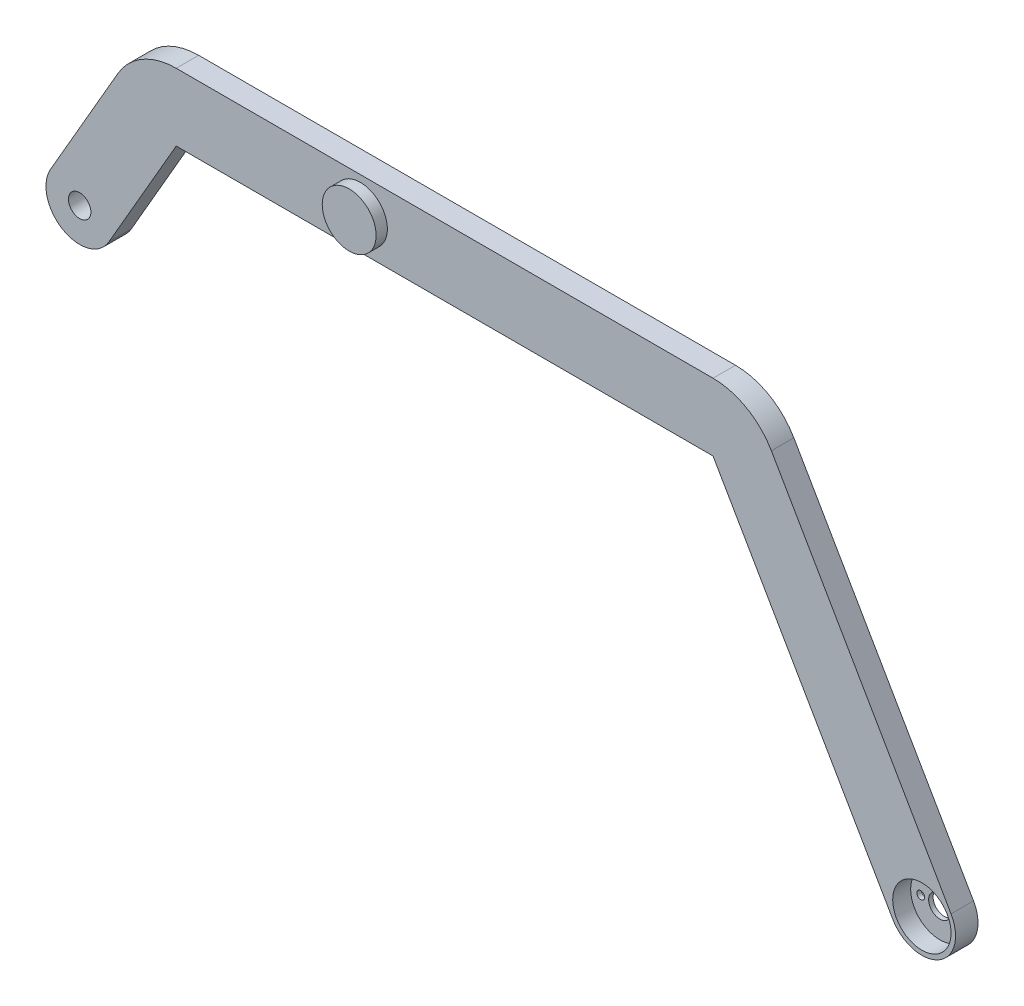
ISO-10303-21;
HEADER;
FILE_DESCRIPTION(('STEP AP214'),'2;1');
FILE_NAME('part.step','',(''),(''),'','','');
FILE_SCHEMA(('AUTOMOTIVE_DESIGN { 1 0 10303 214 1 1 1 1 }'));
ENDSEC;
DATA;
#1=APPLICATION_CONTEXT('core data for automotive mechanical design processes');
#2=APPLICATION_PROTOCOL_DEFINITION('international standard','automotive_design',2000,#1);
#3=PRODUCT_CONTEXT('',#1,'mechanical');
#4=PRODUCT('Part','Part','',(#3));
#5=PRODUCT_RELATED_PRODUCT_CATEGORY('part','',(#4));
#6=PRODUCT_DEFINITION_FORMATION('','',#4);
#7=PRODUCT_DEFINITION_CONTEXT('part definition',#1,'design');
#8=PRODUCT_DEFINITION('design','',#6,#7);
#9=PRODUCT_DEFINITION_SHAPE('','',#8);
#10=(LENGTH_UNIT() NAMED_UNIT(*) SI_UNIT(.MILLI.,.METRE.));
#11=(NAMED_UNIT(*) PLANE_ANGLE_UNIT() SI_UNIT($,.RADIAN.));
#12=(NAMED_UNIT(*) SI_UNIT($,.STERADIAN.) SOLID_ANGLE_UNIT());
#13=UNCERTAINTY_MEASURE_WITH_UNIT(LENGTH_MEASURE(1.E-05),#10,'distance_accuracy_value','');
#14=(GEOMETRIC_REPRESENTATION_CONTEXT(3) GLOBAL_UNCERTAINTY_ASSIGNED_CONTEXT((#13)) GLOBAL_UNIT_ASSIGNED_CONTEXT((#10,
#11,#12)) REPRESENTATION_CONTEXT('',''));
#15=CARTESIAN_POINT('',(0.,0.,0.));
#16=DIRECTION('',(0.,0.,1.));
#17=DIRECTION('',(1.,0.,0.));
#18=AXIS2_PLACEMENT_3D('',#15,#16,#17);
#19=CARTESIAN_POINT('',(258.499974642121,-146.043302059951,-10.));
#20=DIRECTION('',(0.,0.,1.));
#21=DIRECTION('',(-1.,0.,0.));
#22=AXIS2_PLACEMENT_3D('',#19,#20,#21);
#23=CYLINDRICAL_SURFACE('',#22,1.74999999999998);
#24=CARTESIAN_POINT('',(258.499974642121,-146.043302059951,-10.));
#25=DIRECTION('',(0.,0.,1.));
#26=DIRECTION('',(1.,0.,0.));
#27=AXIS2_PLACEMENT_3D('',#24,#25,#26);
#28=CIRCLE('',#27,1.74999999999998);
#29=CARTESIAN_POINT('',(260.249974642121,-146.043302059951,-10.));
#30=VERTEX_POINT('',#29);
#31=EDGE_CURVE('E155',#30,#30,#28,.T.);
#32=ORIENTED_EDGE('',*,*,#31,.F.);
#33=EDGE_LOOP('',(#32));
#34=FACE_BOUND('',#33,.T.);
#35=CARTESIAN_POINT('',(258.499974642121,-146.043302059951,-8.));
#36=DIRECTION('',(0.,0.,-1.));
#37=DIRECTION('',(-1.,0.,0.));
#38=AXIS2_PLACEMENT_3D('',#35,#36,#37);
#39=CIRCLE('',#38,1.74999999999998);
#40=CARTESIAN_POINT('',(256.749974642121,-146.043302059951,-8.));
#41=VERTEX_POINT('',#40);
#42=EDGE_CURVE('E488',#41,#41,#39,.T.);
#43=ORIENTED_EDGE('',*,*,#42,.F.);
#44=EDGE_LOOP('',(#43));
#45=FACE_BOUND('',#44,.T.);
#46=ADVANCED_FACE('F41',(#34,#45),#23,.F.);
#47=CARTESIAN_POINT('',(241.500025357879,-146.084827151071,-10.));
#48=DIRECTION('',(0.,0.,1.));
#49=DIRECTION('',(-1.,0.,0.));
#50=AXIS2_PLACEMENT_3D('',#47,#48,#49);
#51=CYLINDRICAL_SURFACE('',#50,1.75000000000001);
#52=CARTESIAN_POINT('',(241.500025357879,-146.084827151071,-10.));
#53=DIRECTION('',(0.,0.,1.));
#54=DIRECTION('',(1.,0.,0.));
#55=AXIS2_PLACEMENT_3D('',#52,#53,#54);
#56=CIRCLE('',#55,1.75000000000001);
#57=CARTESIAN_POINT('',(243.250025357879,-146.084827151071,-10.));
#58=VERTEX_POINT('',#57);
#59=EDGE_CURVE('E513',#58,#58,#56,.T.);
#60=ORIENTED_EDGE('',*,*,#59,.F.);
#61=EDGE_LOOP('',(#60));
#62=FACE_BOUND('',#61,.T.);
#63=CARTESIAN_POINT('',(241.500025357879,-146.084827151071,-8.));
#64=DIRECTION('',(0.,0.,-1.));
#65=DIRECTION('',(-1.,0.,0.));
#66=AXIS2_PLACEMENT_3D('',#63,#64,#65);
#67=CIRCLE('',#66,1.75000000000001);
#68=CARTESIAN_POINT('',(239.750025357879,-146.084827151071,-8.));
#69=VERTEX_POINT('',#68);
#70=EDGE_CURVE('E485',#69,#69,#67,.T.);
#71=ORIENTED_EDGE('',*,*,#70,.F.);
#72=EDGE_LOOP('',(#71));
#73=FACE_BOUND('',#72,.T.);
#74=ADVANCED_FACE('F238',(#62,#73),#51,.F.);
#75=CARTESIAN_POINT('',(250.,-146.064064605511,14.142135623731));
#76=DIRECTION('',(0.,0.,-1.));
#77=DIRECTION('',(1.,0.,0.));
#78=AXIS2_PLACEMENT_3D('',#75,#76,#77);
#79=CYLINDRICAL_SURFACE('',#78,4.99999999999999);
#80=CARTESIAN_POINT('',(250.,-146.064064605511,-10.));
#81=DIRECTION('',(0.,0.,1.));
#82=DIRECTION('',(1.,0.,0.));
#83=AXIS2_PLACEMENT_3D('',#80,#81,#82);
#84=CIRCLE('',#83,4.99999999999999);
#85=CARTESIAN_POINT('',(255.,-146.064064605511,-10.));
#86=VERTEX_POINT('',#85);
#87=EDGE_CURVE('E481',#86,#86,#84,.T.);
#88=ORIENTED_EDGE('',*,*,#87,.F.);
#89=EDGE_LOOP('',(#88));
#90=FACE_BOUND('',#89,.T.);
#91=CARTESIAN_POINT('',(250.,-146.064064605511,-8.));
#92=DIRECTION('',(0.,0.,-1.));
#93=DIRECTION('',(-1.,0.,0.));
#94=AXIS2_PLACEMENT_3D('',#91,#92,#93);
#95=CIRCLE('',#94,4.99999999999999);
#96=CARTESIAN_POINT('',(245.,-146.064064605511,-8.));
#97=VERTEX_POINT('',#96);
#98=EDGE_CURVE('E45',#97,#97,#95,.F.);
#99=ORIENTED_EDGE('',*,*,#98,.T.);
#100=EDGE_LOOP('',(#99));
#101=FACE_BOUND('',#100,.T.);
#102=ADVANCED_FACE('F244',(#90,#101),#79,.F.);
#103=CARTESIAN_POINT('',(-82.0096189432334,-15.,-10.));
#104=DIRECTION('',(0.,0.,1.));
#105=DIRECTION('',(-1.,0.,0.));
#106=AXIS2_PLACEMENT_3D('',#103,#104,#105);
#107=PLANE('',#106);
#108=CARTESIAN_POINT('',(-125.,-59.4615242270663,-10.));
#109=DIRECTION('',(0.,0.,1.));
#110=DIRECTION('',(1.,0.,0.));
#111=AXIS2_PLACEMENT_3D('',#108,#109,#110);
#112=CIRCLE('',#111,5.00000000000001);
#113=CARTESIAN_POINT('',(-120.,-59.4615242270663,-10.));
#114=VERTEX_POINT('',#113);
#115=EDGE_CURVE('E507',#114,#114,#112,.T.);
#116=ORIENTED_EDGE('',*,*,#115,.T.);
#117=EDGE_LOOP('',(#116));
#118=FACE_BOUND('',#117,.T.);
#119=ORIENTED_EDGE('',*,*,#87,.T.);
#120=EDGE_LOOP('',(#119));
#121=FACE_BOUND('',#120,.T.);
#122=CARTESIAN_POINT('',(0.,0.,-10.));
#123=DIRECTION('',(0.,0.,1.));
#124=DIRECTION('',(1.,0.,0.));
#125=AXIS2_PLACEMENT_3D('',#122,#123,#124);
#126=CIRCLE('',#125,5.);
#127=CARTESIAN_POINT('',(5.,0.,-10.));
#128=VERTEX_POINT('',#127);
#129=EDGE_CURVE('E515',#128,#128,#126,.T.);
#130=ORIENTED_EDGE('',*,*,#129,.T.);
#131=EDGE_LOOP('',(#130));
#132=FACE_BOUND('',#131,.T.);
#133=DIRECTION('',(-1.,0.,0.));
#134=VECTOR('',#133,1.);
#135=CARTESIAN_POINT('',(0.,15.,-10.));
#136=LINE('',#135,#134);
#137=CARTESIAN_POINT('',(157.009618943233,15.,-10.));
#138=VERTEX_POINT('',#137);
#139=CARTESIAN_POINT('',(-82.0096189432334,15.,-10.));
#140=VERTEX_POINT('',#139);
#141=EDGE_CURVE('E179',#138,#140,#136,.T.);
#142=ORIENTED_EDGE('',*,*,#141,.F.);
#143=CARTESIAN_POINT('',(157.009618943233,-15.,-10.));
#144=DIRECTION('',(0.,0.,1.));
#145=DIRECTION('',(1.,0.,0.));
#146=AXIS2_PLACEMENT_3D('',#143,#144,#145);
#147=CIRCLE('',#146,30.);
#148=CARTESIAN_POINT('',(182.990381056766,0.,-10.));
#149=VERTEX_POINT('',#148);
#150=EDGE_CURVE('E146',#149,#138,#147,.T.);
#151=ORIENTED_EDGE('',*,*,#150,.F.);
#152=DIRECTION('',(-0.5,0.866025403784438,0.));
#153=VECTOR('',#152,1.);
#154=CARTESIAN_POINT('',(262.990381056767,-138.564064605511,-10.));
#155=LINE('',#154,#153);
#156=CARTESIAN_POINT('',(262.990381056767,-138.564064605511,-10.));
#157=VERTEX_POINT('',#156);
#158=EDGE_CURVE('E126',#157,#149,#155,.T.);
#159=ORIENTED_EDGE('',*,*,#158,.F.);
#160=CARTESIAN_POINT('',(250.,-146.064064605511,-10.));
#161=DIRECTION('',(0.,0.,1.));
#162=DIRECTION('',(1.,0.,0.));
#163=AXIS2_PLACEMENT_3D('',#160,#161,#162);
#164=CIRCLE('',#163,15.);
#165=CARTESIAN_POINT('',(237.009618943233,-153.564064605511,-10.));
#166=VERTEX_POINT('',#165);
#167=EDGE_CURVE('E136',#166,#157,#164,.T.);
#168=ORIENTED_EDGE('',*,*,#167,.F.);
#169=DIRECTION('',(0.5,-0.866025403784439,0.));
#170=VECTOR('',#169,1.);
#171=CARTESIAN_POINT('',(157.009618943233,-15.,-10.));
#172=LINE('',#171,#170);
#173=CARTESIAN_POINT('',(157.009618943233,-15.,-10.));
#174=VERTEX_POINT('',#173);
#175=EDGE_CURVE('E141',#174,#166,#172,.T.);
#176=ORIENTED_EDGE('',*,*,#175,.F.);
#177=DIRECTION('',(1.,0.,0.));
#178=VECTOR('',#177,1.);
#179=CARTESIAN_POINT('',(0.,-15.,-10.));
#180=LINE('',#179,#178);
#181=CARTESIAN_POINT('',(-82.0096189432334,-15.,-10.));
#182=VERTEX_POINT('',#181);
#183=EDGE_CURVE('E214',#182,#174,#180,.T.);
#184=ORIENTED_EDGE('',*,*,#183,.F.);
#185=DIRECTION('',(0.5,0.866025403784438,0.));
#186=VECTOR('',#185,1.);
#187=CARTESIAN_POINT('',(-82.0096189432334,-15.,-10.));
#188=LINE('',#187,#186);
#189=CARTESIAN_POINT('',(-112.009618943233,-66.9615242270663,-10.));
#190=VERTEX_POINT('',#189);
#191=EDGE_CURVE('E211',#190,#182,#188,.T.);
#192=ORIENTED_EDGE('',*,*,#191,.F.);
#193=CARTESIAN_POINT('',(-125.,-59.4615242270666,-10.));
#194=DIRECTION('',(0.,0.,1.));
#195=DIRECTION('',(1.,0.,0.));
#196=AXIS2_PLACEMENT_3D('',#193,#194,#195);
#197=CIRCLE('',#196,15.);
#198=CARTESIAN_POINT('',(-137.990381056766,-51.9615242270664,-10.));
#199=VERTEX_POINT('',#198);
#200=EDGE_CURVE('E208',#199,#190,#197,.T.);
#201=ORIENTED_EDGE('',*,*,#200,.F.);
#202=DIRECTION('',(-0.5,-0.866025403784438,0.));
#203=VECTOR('',#202,1.);
#204=CARTESIAN_POINT('',(-137.990381056767,-51.9615242270663,-10.));
#205=LINE('',#204,#203);
#206=CARTESIAN_POINT('',(-107.990381056767,0.,-10.));
#207=VERTEX_POINT('',#206);
#208=EDGE_CURVE('E202',#207,#199,#205,.T.);
#209=ORIENTED_EDGE('',*,*,#208,.F.);
#210=CARTESIAN_POINT('',(-82.0096189432334,-15.,-10.));
#211=DIRECTION('',(0.,0.,1.));
#212=DIRECTION('',(-1.,0.,0.));
#213=AXIS2_PLACEMENT_3D('',#210,#211,#212);
#214=CIRCLE('',#213,30.);
#215=EDGE_CURVE('E192',#140,#207,#214,.T.);
#216=ORIENTED_EDGE('',*,*,#215,.F.);
#217=EDGE_LOOP('',(#142,#151,#159,#168,#176,#184,#192,#201,#209,#216));
#218=FACE_BOUND('',#217,.T.);
#219=ORIENTED_EDGE('',*,*,#31,.T.);
#220=EDGE_LOOP('',(#219));
#221=FACE_BOUND('',#220,.T.);
#222=ORIENTED_EDGE('',*,*,#59,.T.);
#223=EDGE_LOOP('',(#222));
#224=FACE_BOUND('',#223,.T.);
#225=ADVANCED_FACE('F144',(#118,#121,#132,#218,#221,#224),#107,.F.);
#226=CARTESIAN_POINT('',(-82.0096189432334,-15.,0.));
#227=DIRECTION('',(0.,0.,1.));
#228=DIRECTION('',(-1.,0.,0.));
#229=AXIS2_PLACEMENT_3D('',#226,#227,#228);
#230=PLANE('',#229);
#231=CARTESIAN_POINT('',(250.,-146.064064605511,0.));
#232=DIRECTION('',(0.,0.,-1.));
#233=DIRECTION('',(-1.,0.,0.));
#234=AXIS2_PLACEMENT_3D('',#231,#232,#233);
#235=CIRCLE('',#234,13.);
#236=CARTESIAN_POINT('',(237.,-146.064064605511,0.));
#237=VERTEX_POINT('',#236);
#238=EDGE_CURVE('E491',#237,#237,#235,.T.);
#239=ORIENTED_EDGE('',*,*,#238,.T.);
#240=EDGE_LOOP('',(#239));
#241=FACE_BOUND('',#240,.T.);
#242=CARTESIAN_POINT('',(0.,0.,0.));
#243=DIRECTION('',(0.,0.,-1.));
#244=DIRECTION('',(-1.,0.,0.));
#245=AXIS2_PLACEMENT_3D('',#242,#243,#244);
#246=CIRCLE('',#245,12.);
#247=CARTESIAN_POINT('',(-12.,0.,0.));
#248=VERTEX_POINT('',#247);
#249=EDGE_CURVE('E500',#248,#248,#246,.T.);
#250=ORIENTED_EDGE('',*,*,#249,.T.);
#251=EDGE_LOOP('',(#250));
#252=FACE_BOUND('',#251,.T.);
#253=CARTESIAN_POINT('',(-125.,-59.4615242270663,0.));
#254=DIRECTION('',(0.,0.,-1.));
#255=DIRECTION('',(-1.,0.,0.));
#256=AXIS2_PLACEMENT_3D('',#253,#254,#255);
#257=CIRCLE('',#256,5.00000000000001);
#258=CARTESIAN_POINT('',(-130.,-59.4615242270663,0.));
#259=VERTEX_POINT('',#258);
#260=EDGE_CURVE('E510',#259,#259,#257,.F.);
#261=ORIENTED_EDGE('',*,*,#260,.F.);
#262=EDGE_LOOP('',(#261));
#263=FACE_BOUND('',#262,.T.);
#264=CARTESIAN_POINT('',(-82.0096189432334,-15.,0.));
#265=DIRECTION('',(0.,0.,1.));
#266=DIRECTION('',(-1.,0.,0.));
#267=AXIS2_PLACEMENT_3D('',#264,#265,#266);
#268=CIRCLE('',#267,30.);
#269=CARTESIAN_POINT('',(-82.0096189432334,15.,0.));
#270=VERTEX_POINT('',#269);
#271=CARTESIAN_POINT('',(-107.990381056767,0.,0.));
#272=VERTEX_POINT('',#271);
#273=EDGE_CURVE('E151',#270,#272,#268,.T.);
#274=ORIENTED_EDGE('',*,*,#273,.T.);
#275=DIRECTION('',(-0.5,-0.866025403784438,0.));
#276=VECTOR('',#275,1.);
#277=CARTESIAN_POINT('',(-137.990381056767,-51.9615242270663,0.));
#278=LINE('',#277,#276);
#279=CARTESIAN_POINT('',(-137.990381056766,-51.9615242270664,0.));
#280=VERTEX_POINT('',#279);
#281=EDGE_CURVE('E154',#272,#280,#278,.T.);
#282=ORIENTED_EDGE('',*,*,#281,.T.);
#283=CARTESIAN_POINT('',(-125.,-59.4615242270666,0.));
#284=DIRECTION('',(0.,0.,1.));
#285=DIRECTION('',(1.,0.,0.));
#286=AXIS2_PLACEMENT_3D('',#283,#284,#285);
#287=CIRCLE('',#286,15.);
#288=CARTESIAN_POINT('',(-112.009618943233,-66.9615242270663,0.));
#289=VERTEX_POINT('',#288);
#290=EDGE_CURVE('E158',#280,#289,#287,.T.);
#291=ORIENTED_EDGE('',*,*,#290,.T.);
#292=DIRECTION('',(0.5,0.866025403784438,0.));
#293=VECTOR('',#292,1.);
#294=CARTESIAN_POINT('',(-82.0096189432334,-15.,0.));
#295=LINE('',#294,#293);
#296=CARTESIAN_POINT('',(-82.0096189432334,-15.,0.));
#297=VERTEX_POINT('',#296);
#298=EDGE_CURVE('E161',#289,#297,#295,.T.);
#299=ORIENTED_EDGE('',*,*,#298,.T.);
#300=DIRECTION('',(1.,0.,0.));
#301=VECTOR('',#300,1.);
#302=CARTESIAN_POINT('',(0.,-15.,0.));
#303=LINE('',#302,#301);
#304=CARTESIAN_POINT('',(157.009618943233,-15.,0.));
#305=VERTEX_POINT('',#304);
#306=EDGE_CURVE('E164',#297,#305,#303,.T.);
#307=ORIENTED_EDGE('',*,*,#306,.T.);
#308=DIRECTION('',(0.5,-0.866025403784439,0.));
#309=VECTOR('',#308,1.);
#310=CARTESIAN_POINT('',(157.009618943233,-15.,0.));
#311=LINE('',#310,#309);
#312=CARTESIAN_POINT('',(237.009618943233,-153.564064605511,0.));
#313=VERTEX_POINT('',#312);
#314=EDGE_CURVE('E167',#305,#313,#311,.T.);
#315=ORIENTED_EDGE('',*,*,#314,.T.);
#316=CARTESIAN_POINT('',(250.,-146.064064605511,0.));
#317=DIRECTION('',(0.,0.,1.));
#318=DIRECTION('',(1.,0.,0.));
#319=AXIS2_PLACEMENT_3D('',#316,#317,#318);
#320=CIRCLE('',#319,15.);
#321=CARTESIAN_POINT('',(262.990381056767,-138.564064605511,0.));
#322=VERTEX_POINT('',#321);
#323=EDGE_CURVE('E170',#313,#322,#320,.T.);
#324=ORIENTED_EDGE('',*,*,#323,.T.);
#325=DIRECTION('',(-0.5,0.866025403784438,0.));
#326=VECTOR('',#325,1.);
#327=CARTESIAN_POINT('',(262.990381056767,-138.564064605511,0.));
#328=LINE('',#327,#326);
#329=CARTESIAN_POINT('',(182.990381056766,0.,0.));
#330=VERTEX_POINT('',#329);
#331=EDGE_CURVE('E129',#322,#330,#328,.T.);
#332=ORIENTED_EDGE('',*,*,#331,.T.);
#333=CARTESIAN_POINT('',(157.009618943233,-15.,0.));
#334=DIRECTION('',(0.,0.,1.));
#335=DIRECTION('',(1.,0.,0.));
#336=AXIS2_PLACEMENT_3D('',#333,#334,#335);
#337=CIRCLE('',#336,30.);
#338=CARTESIAN_POINT('',(157.009618943233,15.,0.));
#339=VERTEX_POINT('',#338);
#340=EDGE_CURVE('E173',#330,#339,#337,.T.);
#341=ORIENTED_EDGE('',*,*,#340,.T.);
#342=DIRECTION('',(-1.,0.,0.));
#343=VECTOR('',#342,1.);
#344=CARTESIAN_POINT('',(0.,15.,0.));
#345=LINE('',#344,#343);
#346=EDGE_CURVE('E176',#339,#270,#345,.T.);
#347=ORIENTED_EDGE('',*,*,#346,.T.);
#348=EDGE_LOOP('',(#274,#282,#291,#299,#307,#315,#324,#332,#341,#347));
#349=FACE_BOUND('',#348,.T.);
#350=ADVANCED_FACE('F199',(#241,#252,#263,#349),#230,.T.);
#351=CARTESIAN_POINT('',(-82.0096189432334,-15.,-10.));
#352=DIRECTION('',(0.,0.,1.));
#353=DIRECTION('',(-1.,0.,0.));
#354=AXIS2_PLACEMENT_3D('',#351,#352,#353);
#355=CYLINDRICAL_SURFACE('',#354,30.);
#356=ORIENTED_EDGE('',*,*,#273,.F.);
#357=DIRECTION('',(0.,0.,1.));
#358=VECTOR('',#357,1.);
#359=CARTESIAN_POINT('',(-82.0096189432334,15.,-10.));
#360=LINE('',#359,#358);
#361=EDGE_CURVE('E12',#140,#270,#360,.T.);
#362=ORIENTED_EDGE('',*,*,#361,.F.);
#363=ORIENTED_EDGE('',*,*,#215,.T.);
#364=DIRECTION('',(0.,0.,1.));
#365=VECTOR('',#364,1.);
#366=CARTESIAN_POINT('',(-107.990381056767,0.,-10.));
#367=LINE('',#366,#365);
#368=EDGE_CURVE('E51',#207,#272,#367,.T.);
#369=ORIENTED_EDGE('',*,*,#368,.T.);
#370=EDGE_LOOP('',(#356,#362,#363,#369));
#371=FACE_BOUND('',#370,.T.);
#372=ADVANCED_FACE('F43',(#371),#355,.T.);
#373=CARTESIAN_POINT('',(-137.990381056767,-51.9615242270663,-10.));
#374=DIRECTION('',(0.866025403784438,-0.5,0.));
#375=DIRECTION('',(0.5,0.866025403784438,0.));
#376=AXIS2_PLACEMENT_3D('',#373,#374,#375);
#377=PLANE('',#376);
#378=ORIENTED_EDGE('',*,*,#281,.F.);
#379=ORIENTED_EDGE('',*,*,#368,.F.);
#380=ORIENTED_EDGE('',*,*,#208,.T.);
#381=DIRECTION('',(0.,0.,1.));
#382=VECTOR('',#381,1.);
#383=CARTESIAN_POINT('',(-137.990381056766,-51.9615242270664,-10.));
#384=LINE('',#383,#382);
#385=EDGE_CURVE('E189',#199,#280,#384,.T.);
#386=ORIENTED_EDGE('',*,*,#385,.T.);
#387=EDGE_LOOP('',(#378,#379,#380,#386));
#388=FACE_BOUND('',#387,.T.);
#389=ADVANCED_FACE('F196',(#388),#377,.F.);
#390=CARTESIAN_POINT('',(-125.,-59.4615242270666,-10.));
#391=DIRECTION('',(0.,0.,1.));
#392=DIRECTION('',(-1.,0.,0.));
#393=AXIS2_PLACEMENT_3D('',#390,#391,#392);
#394=CYLINDRICAL_SURFACE('',#393,15.);
#395=ORIENTED_EDGE('',*,*,#290,.F.);
#396=ORIENTED_EDGE('',*,*,#385,.F.);
#397=ORIENTED_EDGE('',*,*,#200,.T.);
#398=DIRECTION('',(0.,0.,1.));
#399=VECTOR('',#398,1.);
#400=CARTESIAN_POINT('',(-112.009618943233,-66.9615242270663,-10.));
#401=LINE('',#400,#399);
#402=EDGE_CURVE('E187',#190,#289,#401,.T.);
#403=ORIENTED_EDGE('',*,*,#402,.T.);
#404=EDGE_LOOP('',(#395,#396,#397,#403));
#405=FACE_BOUND('',#404,.T.);
#406=ADVANCED_FACE('F229',(#405),#394,.T.);
#407=CARTESIAN_POINT('',(-82.0096189432334,-15.,-10.));
#408=DIRECTION('',(-0.866025403784439,0.5,0.));
#409=DIRECTION('',(-0.5,-0.866025403784439,0.));
#410=AXIS2_PLACEMENT_3D('',#407,#408,#409);
#411=PLANE('',#410);
#412=ORIENTED_EDGE('',*,*,#298,.F.);
#413=ORIENTED_EDGE('',*,*,#402,.F.);
#414=ORIENTED_EDGE('',*,*,#191,.T.);
#415=DIRECTION('',(0.,0.,1.));
#416=VECTOR('',#415,1.);
#417=CARTESIAN_POINT('',(-82.0096189432334,-15.,-10.));
#418=LINE('',#417,#416);
#419=EDGE_CURVE('E185',#182,#297,#418,.T.);
#420=ORIENTED_EDGE('',*,*,#419,.T.);
#421=EDGE_LOOP('',(#412,#413,#414,#420));
#422=FACE_BOUND('',#421,.T.);
#423=ADVANCED_FACE('F227',(#422),#411,.F.);
#424=CARTESIAN_POINT('',(0.,-15.,-10.));
#425=DIRECTION('',(0.,1.,0.));
#426=DIRECTION('',(-1.,0.,0.));
#427=AXIS2_PLACEMENT_3D('',#424,#425,#426);
#428=PLANE('',#427);
#429=ORIENTED_EDGE('',*,*,#306,.F.);
#430=ORIENTED_EDGE('',*,*,#419,.F.);
#431=ORIENTED_EDGE('',*,*,#183,.T.);
#432=DIRECTION('',(0.,0.,1.));
#433=VECTOR('',#432,1.);
#434=CARTESIAN_POINT('',(157.009618943233,-15.,-10.));
#435=LINE('',#434,#433);
#436=EDGE_CURVE('E183',#174,#305,#435,.T.);
#437=ORIENTED_EDGE('',*,*,#436,.T.);
#438=EDGE_LOOP('',(#429,#430,#431,#437));
#439=FACE_BOUND('',#438,.T.);
#440=ADVANCED_FACE('F224',(#439),#428,.F.);
#441=CARTESIAN_POINT('',(157.009618943233,-15.,-10.));
#442=DIRECTION('',(0.866025403784439,0.5,0.));
#443=DIRECTION('',(-0.5,0.866025403784439,0.));
#444=AXIS2_PLACEMENT_3D('',#441,#442,#443);
#445=PLANE('',#444);
#446=ORIENTED_EDGE('',*,*,#314,.F.);
#447=ORIENTED_EDGE('',*,*,#436,.F.);
#448=ORIENTED_EDGE('',*,*,#175,.T.);
#449=DIRECTION('',(0.,0.,1.));
#450=VECTOR('',#449,1.);
#451=CARTESIAN_POINT('',(237.009618943233,-153.564064605511,-10.));
#452=LINE('',#451,#450);
#453=EDGE_CURVE('E133',#166,#313,#452,.T.);
#454=ORIENTED_EDGE('',*,*,#453,.T.);
#455=EDGE_LOOP('',(#446,#447,#448,#454));
#456=FACE_BOUND('',#455,.T.);
#457=ADVANCED_FACE('F218',(#456),#445,.F.);
#458=CARTESIAN_POINT('',(250.,-146.064064605511,-10.));
#459=DIRECTION('',(0.,0.,1.));
#460=DIRECTION('',(-1.,0.,0.));
#461=AXIS2_PLACEMENT_3D('',#458,#459,#460);
#462=CYLINDRICAL_SURFACE('',#461,15.);
#463=ORIENTED_EDGE('',*,*,#323,.F.);
#464=ORIENTED_EDGE('',*,*,#453,.F.);
#465=ORIENTED_EDGE('',*,*,#167,.T.);
#466=DIRECTION('',(0.,0.,1.));
#467=VECTOR('',#466,1.);
#468=CARTESIAN_POINT('',(262.990381056767,-138.564064605511,-10.));
#469=LINE('',#468,#467);
#470=EDGE_CURVE('E122',#157,#322,#469,.T.);
#471=ORIENTED_EDGE('',*,*,#470,.T.);
#472=EDGE_LOOP('',(#463,#464,#465,#471));
#473=FACE_BOUND('',#472,.T.);
#474=ADVANCED_FACE('F137',(#473),#462,.T.);
#475=CARTESIAN_POINT('',(262.990381056767,-138.564064605511,-10.));
#476=DIRECTION('',(-0.866025403784438,-0.5,0.));
#477=DIRECTION('',(0.5,-0.866025403784439,0.));
#478=AXIS2_PLACEMENT_3D('',#475,#476,#477);
#479=PLANE('',#478);
#480=ORIENTED_EDGE('',*,*,#331,.F.);
#481=ORIENTED_EDGE('',*,*,#470,.F.);
#482=ORIENTED_EDGE('',*,*,#158,.T.);
#483=DIRECTION('',(0.,0.,1.));
#484=VECTOR('',#483,1.);
#485=CARTESIAN_POINT('',(182.990381056766,0.,-10.));
#486=LINE('',#485,#484);
#487=EDGE_CURVE('E93',#149,#330,#486,.T.);
#488=ORIENTED_EDGE('',*,*,#487,.T.);
#489=EDGE_LOOP('',(#480,#481,#482,#488));
#490=FACE_BOUND('',#489,.T.);
#491=ADVANCED_FACE('F124',(#490),#479,.F.);
#492=CARTESIAN_POINT('',(157.009618943233,-15.,-10.));
#493=DIRECTION('',(0.,0.,1.));
#494=DIRECTION('',(-1.,0.,0.));
#495=AXIS2_PLACEMENT_3D('',#492,#493,#494);
#496=CYLINDRICAL_SURFACE('',#495,30.);
#497=ORIENTED_EDGE('',*,*,#340,.F.);
#498=ORIENTED_EDGE('',*,*,#487,.F.);
#499=ORIENTED_EDGE('',*,*,#150,.T.);
#500=DIRECTION('',(0.,0.,1.));
#501=VECTOR('',#500,1.);
#502=CARTESIAN_POINT('',(157.009618943233,15.,-10.));
#503=LINE('',#502,#501);
#504=EDGE_CURVE('E59',#138,#339,#503,.T.);
#505=ORIENTED_EDGE('',*,*,#504,.T.);
#506=EDGE_LOOP('',(#497,#498,#499,#505));
#507=FACE_BOUND('',#506,.T.);
#508=ADVANCED_FACE('F260',(#507),#496,.T.);
#509=CARTESIAN_POINT('',(0.,15.,-10.));
#510=DIRECTION('',(0.,-1.,0.));
#511=DIRECTION('',(1.,0.,0.));
#512=AXIS2_PLACEMENT_3D('',#509,#510,#511);
#513=PLANE('',#512);
#514=ORIENTED_EDGE('',*,*,#346,.F.);
#515=ORIENTED_EDGE('',*,*,#504,.F.);
#516=ORIENTED_EDGE('',*,*,#141,.T.);
#517=ORIENTED_EDGE('',*,*,#361,.T.);
#518=EDGE_LOOP('',(#514,#515,#516,#517));
#519=FACE_BOUND('',#518,.T.);
#520=ADVANCED_FACE('F200',(#519),#513,.F.);
#521=CARTESIAN_POINT('',(0.,0.,14.142135623731));
#522=DIRECTION('',(0.,0.,-1.));
#523=DIRECTION('',(1.,0.,0.));
#524=AXIS2_PLACEMENT_3D('',#521,#522,#523);
#525=CYLINDRICAL_SURFACE('',#524,5.);
#526=ORIENTED_EDGE('',*,*,#129,.F.);
#527=EDGE_LOOP('',(#526));
#528=FACE_BOUND('',#527,.T.);
#529=CARTESIAN_POINT('',(0.,0.,0.));
#530=DIRECTION('',(0.,0.,-1.));
#531=DIRECTION('',(-1.,0.,0.));
#532=AXIS2_PLACEMENT_3D('',#529,#530,#531);
#533=CIRCLE('',#532,5.);
#534=CARTESIAN_POINT('',(-5.,0.,0.));
#535=VERTEX_POINT('',#534);
#536=EDGE_CURVE('E504',#535,#535,#533,.F.);
#537=ORIENTED_EDGE('',*,*,#536,.T.);
#538=EDGE_LOOP('',(#537));
#539=FACE_BOUND('',#538,.T.);
#540=ADVANCED_FACE('F259',(#528,#539),#525,.F.);
#541=CARTESIAN_POINT('',(-125.,-59.4615242270663,14.142135623731));
#542=DIRECTION('',(0.,0.,-1.));
#543=DIRECTION('',(1.,0.,0.));
#544=AXIS2_PLACEMENT_3D('',#541,#542,#543);
#545=CYLINDRICAL_SURFACE('',#544,5.00000000000001);
#546=ORIENTED_EDGE('',*,*,#115,.F.);
#547=EDGE_LOOP('',(#546));
#548=FACE_BOUND('',#547,.T.);
#549=ORIENTED_EDGE('',*,*,#260,.T.);
#550=EDGE_LOOP('',(#549));
#551=FACE_BOUND('',#550,.T.);
#552=ADVANCED_FACE('F300',(#548,#551),#545,.F.);
#553=CARTESIAN_POINT('',(0.,0.,0.));
#554=DIRECTION('',(0.,0.,1.));
#555=DIRECTION('',(-1.,0.,0.));
#556=AXIS2_PLACEMENT_3D('',#553,#554,#555);
#557=PLANE('',#556);
#558=ORIENTED_EDGE('',*,*,#536,.F.);
#559=EDGE_LOOP('',(#558));
#560=FACE_BOUND('',#559,.T.);
#561=ADVANCED_FACE('F307',(#560),#557,.F.);
#562=CARTESIAN_POINT('',(0.,0.,5.));
#563=DIRECTION('',(0.,0.,-1.));
#564=DIRECTION('',(1.,0.,0.));
#565=AXIS2_PLACEMENT_3D('',#562,#563,#564);
#566=CYLINDRICAL_SURFACE('',#565,12.);
#567=CARTESIAN_POINT('',(0.,0.,5.));
#568=DIRECTION('',(0.,0.,-1.));
#569=DIRECTION('',(-1.,0.,0.));
#570=AXIS2_PLACEMENT_3D('',#567,#568,#569);
#571=CIRCLE('',#570,12.);
#572=CARTESIAN_POINT('',(-12.,0.,5.));
#573=VERTEX_POINT('',#572);
#574=EDGE_CURVE('E501',#573,#573,#571,.T.);
#575=ORIENTED_EDGE('',*,*,#574,.T.);
#576=EDGE_LOOP('',(#575));
#577=FACE_BOUND('',#576,.T.);
#578=ORIENTED_EDGE('',*,*,#249,.F.);
#579=EDGE_LOOP('',(#578));
#580=FACE_BOUND('',#579,.T.);
#581=ADVANCED_FACE('F315',(#577,#580),#566,.T.);
#582=CARTESIAN_POINT('',(0.,0.,5.));
#583=DIRECTION('',(0.,0.,1.));
#584=DIRECTION('',(-1.,0.,0.));
#585=AXIS2_PLACEMENT_3D('',#582,#583,#584);
#586=PLANE('',#585);
#587=ORIENTED_EDGE('',*,*,#574,.F.);
#588=EDGE_LOOP('',(#587));
#589=FACE_BOUND('',#588,.T.);
#590=ADVANCED_FACE('F323',(#589),#586,.T.);
#591=CARTESIAN_POINT('',(-82.0096189432334,-15.,-8.));
#592=DIRECTION('',(0.,0.,1.));
#593=DIRECTION('',(-1.,0.,0.));
#594=AXIS2_PLACEMENT_3D('',#591,#592,#593);
#595=PLANE('',#594);
#596=ORIENTED_EDGE('',*,*,#42,.T.);
#597=EDGE_LOOP('',(#596));
#598=FACE_BOUND('',#597,.T.);
#599=ORIENTED_EDGE('',*,*,#70,.T.);
#600=EDGE_LOOP('',(#599));
#601=FACE_BOUND('',#600,.T.);
#602=CARTESIAN_POINT('',(250.,-146.064064605511,-8.));
#603=DIRECTION('',(0.,0.,-1.));
#604=DIRECTION('',(-1.,0.,0.));
#605=AXIS2_PLACEMENT_3D('',#602,#603,#604);
#606=CIRCLE('',#605,13.);
#607=CARTESIAN_POINT('',(237.,-146.064064605511,-8.));
#608=VERTEX_POINT('',#607);
#609=EDGE_CURVE('E486',#608,#608,#606,.F.);
#610=ORIENTED_EDGE('',*,*,#609,.T.);
#611=EDGE_LOOP('',(#610));
#612=FACE_BOUND('',#611,.T.);
#613=ORIENTED_EDGE('',*,*,#98,.F.);
#614=EDGE_LOOP('',(#613));
#615=FACE_BOUND('',#614,.T.);
#616=ADVANCED_FACE('F331',(#598,#601,#612,#615),#595,.T.);
#617=CARTESIAN_POINT('',(250.,-146.064064605511,-46.7695526217005));
#618=DIRECTION('',(0.,0.,1.));
#619=DIRECTION('',(-1.,0.,0.));
#620=AXIS2_PLACEMENT_3D('',#617,#618,#619);
#621=CYLINDRICAL_SURFACE('',#620,13.);
#622=ORIENTED_EDGE('',*,*,#609,.F.);
#623=EDGE_LOOP('',(#622));
#624=FACE_BOUND('',#623,.T.);
#625=ORIENTED_EDGE('',*,*,#238,.F.);
#626=EDGE_LOOP('',(#625));
#627=FACE_BOUND('',#626,.T.);
#628=ADVANCED_FACE('F339',(#624,#627),#621,.F.);
#629=CLOSED_SHELL('',(#46,#74,#102,#225,#350,#372,#389,#406,#423,#440,#457,#474,#491,#508,#520,
#540,#552,#561,#581,#590,#616,#628));
#630=MANIFOLD_SOLID_BREP('B2',#629);
#631=ADVANCED_BREP_SHAPE_REPRESENTATION('',(#18,#630),#14);
#632=SHAPE_DEFINITION_REPRESENTATION(#9,#631);
ENDSEC;
END-ISO-10303-21;
